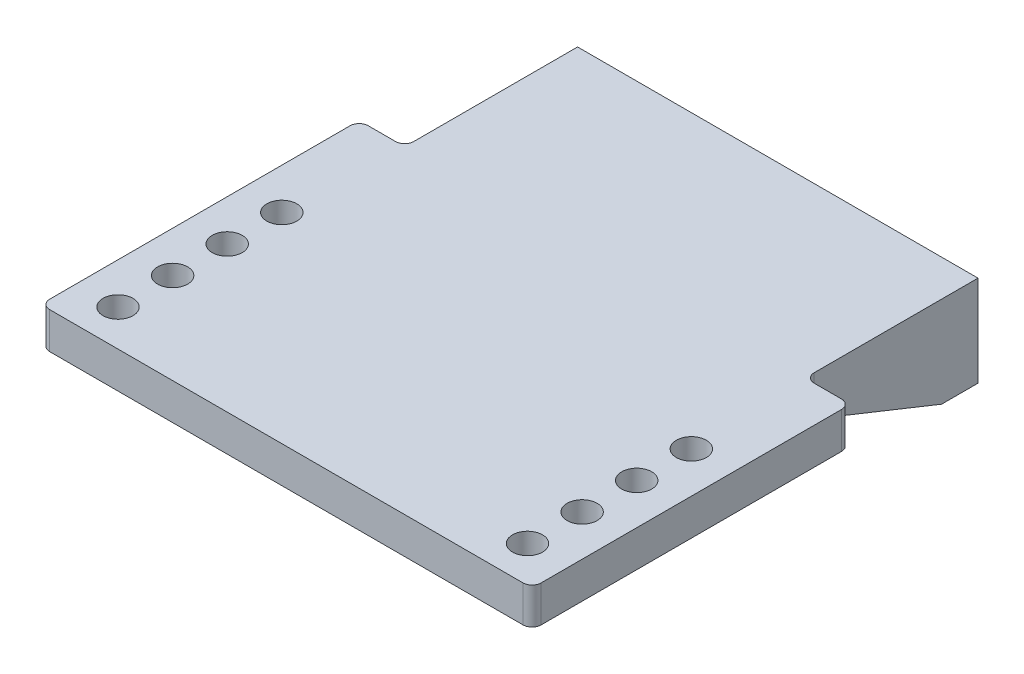
ISO-10303-21;
HEADER;
FILE_DESCRIPTION(('STEP AP214'),'2;1');
FILE_NAME('part.step','',(''),(''),'','','');
FILE_SCHEMA(('AUTOMOTIVE_DESIGN { 1 0 10303 214 1 1 1 1 }'));
ENDSEC;
DATA;
#1=APPLICATION_CONTEXT('core data for automotive mechanical design processes');
#2=APPLICATION_PROTOCOL_DEFINITION('international standard','automotive_design',2000,#1);
#3=PRODUCT_CONTEXT('',#1,'mechanical');
#4=PRODUCT('Part','Part','',(#3));
#5=PRODUCT_RELATED_PRODUCT_CATEGORY('part','',(#4));
#6=PRODUCT_DEFINITION_FORMATION('','',#4);
#7=PRODUCT_DEFINITION_CONTEXT('part definition',#1,'design');
#8=PRODUCT_DEFINITION('design','',#6,#7);
#9=PRODUCT_DEFINITION_SHAPE('','',#8);
#10=(LENGTH_UNIT() NAMED_UNIT(*) SI_UNIT(.MILLI.,.METRE.));
#11=(NAMED_UNIT(*) PLANE_ANGLE_UNIT() SI_UNIT($,.RADIAN.));
#12=(NAMED_UNIT(*) SI_UNIT($,.STERADIAN.) SOLID_ANGLE_UNIT());
#13=UNCERTAINTY_MEASURE_WITH_UNIT(LENGTH_MEASURE(1.E-05),#10,'distance_accuracy_value','');
#14=(GEOMETRIC_REPRESENTATION_CONTEXT(3) GLOBAL_UNCERTAINTY_ASSIGNED_CONTEXT((#13)) GLOBAL_UNIT_ASSIGNED_CONTEXT((#10,
#11,#12)) REPRESENTATION_CONTEXT('',''));
#15=CARTESIAN_POINT('',(0.,0.,0.));
#16=DIRECTION('',(0.,0.,1.));
#17=DIRECTION('',(1.,0.,0.));
#18=AXIS2_PLACEMENT_3D('',#15,#16,#17);
#19=CARTESIAN_POINT('',(44.5,31.9999999999999,18.));
#20=DIRECTION('',(0.,-1.,0.));
#21=DIRECTION('',(1.,0.,0.));
#22=AXIS2_PLACEMENT_3D('',#19,#20,#21);
#23=CYLINDRICAL_SURFACE('',#22,1.65);
#24=CARTESIAN_POINT('',(44.5,31.9999999999999,18.));
#25=DIRECTION('',(0.,-1.,0.));
#26=DIRECTION('',(1.,0.,0.));
#27=AXIS2_PLACEMENT_3D('',#24,#25,#26);
#28=CIRCLE('',#27,1.65);
#29=CARTESIAN_POINT('',(46.15,31.9999999999999,18.));
#30=VERTEX_POINT('',#29);
#31=EDGE_CURVE('E49',#30,#30,#28,.T.);
#32=ORIENTED_EDGE('',*,*,#31,.F.);
#33=EDGE_LOOP('',(#32));
#34=FACE_BOUND('',#33,.T.);
#35=CARTESIAN_POINT('',(44.5,27.9999999999999,18.));
#36=DIRECTION('',(0.,-1.,0.));
#37=DIRECTION('',(1.,0.,0.));
#38=AXIS2_PLACEMENT_3D('',#35,#36,#37);
#39=CIRCLE('',#38,1.65);
#40=CARTESIAN_POINT('',(46.15,27.9999999999999,18.));
#41=VERTEX_POINT('',#40);
#42=EDGE_CURVE('E11',#41,#41,#39,.T.);
#43=ORIENTED_EDGE('',*,*,#42,.T.);
#44=EDGE_LOOP('',(#43));
#45=FACE_BOUND('',#44,.T.);
#46=ADVANCED_FACE('F40',(#34,#45),#23,.F.);
#47=CARTESIAN_POINT('',(44.5,31.9999999999999,12.));
#48=DIRECTION('',(0.,-1.,0.));
#49=DIRECTION('',(1.,0.,0.));
#50=AXIS2_PLACEMENT_3D('',#47,#48,#49);
#51=CYLINDRICAL_SURFACE('',#50,1.65);
#52=CARTESIAN_POINT('',(44.5,31.9999999999999,12.));
#53=DIRECTION('',(0.,-1.,0.));
#54=DIRECTION('',(1.,0.,0.));
#55=AXIS2_PLACEMENT_3D('',#52,#53,#54);
#56=CIRCLE('',#55,1.65);
#57=CARTESIAN_POINT('',(46.15,31.9999999999999,12.));
#58=VERTEX_POINT('',#57);
#59=EDGE_CURVE('E320',#58,#58,#56,.T.);
#60=ORIENTED_EDGE('',*,*,#59,.F.);
#61=EDGE_LOOP('',(#60));
#62=FACE_BOUND('',#61,.T.);
#63=CARTESIAN_POINT('',(44.5,27.9999999999999,12.));
#64=DIRECTION('',(0.,-1.,0.));
#65=DIRECTION('',(1.,0.,0.));
#66=AXIS2_PLACEMENT_3D('',#63,#64,#65);
#67=CIRCLE('',#66,1.65);
#68=CARTESIAN_POINT('',(46.15,27.9999999999999,12.));
#69=VERTEX_POINT('',#68);
#70=EDGE_CURVE('E324',#69,#69,#67,.T.);
#71=ORIENTED_EDGE('',*,*,#70,.T.);
#72=EDGE_LOOP('',(#71));
#73=FACE_BOUND('',#72,.T.);
#74=ADVANCED_FACE('F335',(#62,#73),#51,.F.);
#75=CARTESIAN_POINT('',(-0.499999999999994,31.9999999999999,18.));
#76=DIRECTION('',(0.,-1.,0.));
#77=DIRECTION('',(1.,0.,0.));
#78=AXIS2_PLACEMENT_3D('',#75,#76,#77);
#79=CYLINDRICAL_SURFACE('',#78,1.65);
#80=CARTESIAN_POINT('',(-0.499999999999994,31.9999999999999,18.));
#81=DIRECTION('',(0.,-1.,0.));
#82=DIRECTION('',(1.,0.,0.));
#83=AXIS2_PLACEMENT_3D('',#80,#81,#82);
#84=CIRCLE('',#83,1.65);
#85=CARTESIAN_POINT('',(1.15000000000001,31.9999999999999,18.));
#86=VERTEX_POINT('',#85);
#87=EDGE_CURVE('E312',#86,#86,#84,.T.);
#88=ORIENTED_EDGE('',*,*,#87,.F.);
#89=EDGE_LOOP('',(#88));
#90=FACE_BOUND('',#89,.T.);
#91=CARTESIAN_POINT('',(-0.499999999999994,27.9999999999999,18.));
#92=DIRECTION('',(0.,-1.,0.));
#93=DIRECTION('',(1.,0.,0.));
#94=AXIS2_PLACEMENT_3D('',#91,#92,#93);
#95=CIRCLE('',#94,1.65);
#96=CARTESIAN_POINT('',(1.15000000000001,27.9999999999999,18.));
#97=VERTEX_POINT('',#96);
#98=EDGE_CURVE('E316',#97,#97,#95,.T.);
#99=ORIENTED_EDGE('',*,*,#98,.T.);
#100=EDGE_LOOP('',(#99));
#101=FACE_BOUND('',#100,.T.);
#102=ADVANCED_FACE('F412',(#90,#101),#79,.F.);
#103=CARTESIAN_POINT('',(-0.499999999999994,31.9999999999999,12.));
#104=DIRECTION('',(0.,-1.,0.));
#105=DIRECTION('',(1.,0.,0.));
#106=AXIS2_PLACEMENT_3D('',#103,#104,#105);
#107=CYLINDRICAL_SURFACE('',#106,1.65);
#108=CARTESIAN_POINT('',(-0.499999999999994,31.9999999999999,12.));
#109=DIRECTION('',(0.,-1.,0.));
#110=DIRECTION('',(1.,0.,0.));
#111=AXIS2_PLACEMENT_3D('',#108,#109,#110);
#112=CIRCLE('',#111,1.65);
#113=CARTESIAN_POINT('',(1.15000000000001,31.9999999999999,12.));
#114=VERTEX_POINT('',#113);
#115=EDGE_CURVE('E304',#114,#114,#112,.T.);
#116=ORIENTED_EDGE('',*,*,#115,.F.);
#117=EDGE_LOOP('',(#116));
#118=FACE_BOUND('',#117,.T.);
#119=CARTESIAN_POINT('',(-0.499999999999994,27.9999999999999,12.));
#120=DIRECTION('',(0.,-1.,0.));
#121=DIRECTION('',(1.,0.,0.));
#122=AXIS2_PLACEMENT_3D('',#119,#120,#121);
#123=CIRCLE('',#122,1.65);
#124=CARTESIAN_POINT('',(1.15000000000001,27.9999999999999,12.));
#125=VERTEX_POINT('',#124);
#126=EDGE_CURVE('E308',#125,#125,#123,.T.);
#127=ORIENTED_EDGE('',*,*,#126,.T.);
#128=EDGE_LOOP('',(#127));
#129=FACE_BOUND('',#128,.T.);
#130=ADVANCED_FACE('F382',(#118,#129),#107,.F.);
#131=CARTESIAN_POINT('',(0.,22.0000000000001,-28.));
#132=DIRECTION('',(1.,0.,0.));
#133=DIRECTION('',(0.,1.,0.));
#134=AXIS2_PLACEMENT_3D('',#131,#132,#133);
#135=PLANE('',#134);
#136=DIRECTION('',(0.,-0.371390676354101,-0.928476690885261));
#137=VECTOR('',#136,1.);
#138=CARTESIAN_POINT('',(0.,28.,-13.));
#139=LINE('',#138,#137);
#140=CARTESIAN_POINT('',(0.,27.6,-14.));
#141=VERTEX_POINT('',#140);
#142=CARTESIAN_POINT('',(0.,22.0000000000001,-28.));
#143=VERTEX_POINT('',#142);
#144=EDGE_CURVE('E793',#141,#143,#139,.T.);
#145=ORIENTED_EDGE('',*,*,#144,.F.);
#146=DIRECTION('',(0.,-1.,0.));
#147=VECTOR('',#146,1.);
#148=CARTESIAN_POINT('',(0.,32.,-14.));
#149=LINE('',#148,#147);
#150=CARTESIAN_POINT('',(0.,32.,-14.));
#151=VERTEX_POINT('',#150);
#152=EDGE_CURVE('E288',#141,#151,#149,.F.);
#153=ORIENTED_EDGE('',*,*,#152,.T.);
#154=DIRECTION('',(0.,0.,-1.));
#155=VECTOR('',#154,1.);
#156=CARTESIAN_POINT('',(0.,32.0000000000001,-28.));
#157=LINE('',#156,#155);
#158=CARTESIAN_POINT('',(0.,32.0000000000001,-32.));
#159=VERTEX_POINT('',#158);
#160=EDGE_CURVE('E857',#151,#159,#157,.T.);
#161=ORIENTED_EDGE('',*,*,#160,.T.);
#162=DIRECTION('',(0.,-1.,0.));
#163=VECTOR('',#162,1.);
#164=CARTESIAN_POINT('',(0.,22.0000000000001,-32.));
#165=LINE('',#164,#163);
#166=CARTESIAN_POINT('',(0.,22.0000000000001,-32.));
#167=VERTEX_POINT('',#166);
#168=EDGE_CURVE('E849',#159,#167,#165,.T.);
#169=ORIENTED_EDGE('',*,*,#168,.T.);
#170=DIRECTION('',(0.,0.,-1.));
#171=VECTOR('',#170,1.);
#172=CARTESIAN_POINT('',(0.,22.0000000000001,-28.));
#173=LINE('',#172,#171);
#174=EDGE_CURVE('E882',#143,#167,#173,.T.);
#175=ORIENTED_EDGE('',*,*,#174,.F.);
#176=EDGE_LOOP('',(#145,#153,#161,#169,#175));
#177=FACE_BOUND('',#176,.T.);
#178=ADVANCED_FACE('F375',(#177),#135,.F.);
#179=CARTESIAN_POINT('',(44.,22.0000000000001,-28.));
#180=DIRECTION('',(-1.,0.,0.));
#181=DIRECTION('',(0.,-1.,0.));
#182=AXIS2_PLACEMENT_3D('',#179,#180,#181);
#183=PLANE('',#182);
#184=DIRECTION('',(0.,0.,-1.));
#185=VECTOR('',#184,1.);
#186=CARTESIAN_POINT('',(44.,32.0000000000001,-28.));
#187=LINE('',#186,#185);
#188=CARTESIAN_POINT('',(44.,32.,-14.));
#189=VERTEX_POINT('',#188);
#190=CARTESIAN_POINT('',(44.,32.0000000000001,-32.));
#191=VERTEX_POINT('',#190);
#192=EDGE_CURVE('E875',#189,#191,#187,.T.);
#193=ORIENTED_EDGE('',*,*,#192,.F.);
#194=DIRECTION('',(0.,1.,0.));
#195=VECTOR('',#194,1.);
#196=CARTESIAN_POINT('',(44.,28.,-14.));
#197=LINE('',#196,#195);
#198=CARTESIAN_POINT('',(44.,27.6,-14.));
#199=VERTEX_POINT('',#198);
#200=EDGE_CURVE('E232',#189,#199,#197,.F.);
#201=ORIENTED_EDGE('',*,*,#200,.T.);
#202=DIRECTION('',(0.,-0.371390676354101,-0.928476690885261));
#203=VECTOR('',#202,1.);
#204=CARTESIAN_POINT('',(44.,28.,-13.));
#205=LINE('',#204,#203);
#206=CARTESIAN_POINT('',(44.,22.0000000000001,-28.));
#207=VERTEX_POINT('',#206);
#208=EDGE_CURVE('E815',#199,#207,#205,.T.);
#209=ORIENTED_EDGE('',*,*,#208,.T.);
#210=DIRECTION('',(0.,0.,-1.));
#211=VECTOR('',#210,1.);
#212=CARTESIAN_POINT('',(44.,22.0000000000001,-28.));
#213=LINE('',#212,#211);
#214=CARTESIAN_POINT('',(44.,22.0000000000001,-32.));
#215=VERTEX_POINT('',#214);
#216=EDGE_CURVE('E878',#207,#215,#213,.T.);
#217=ORIENTED_EDGE('',*,*,#216,.T.);
#218=DIRECTION('',(0.,1.,0.));
#219=VECTOR('',#218,1.);
#220=CARTESIAN_POINT('',(44.,22.0000000000001,-32.));
#221=LINE('',#220,#219);
#222=EDGE_CURVE('E865',#215,#191,#221,.T.);
#223=ORIENTED_EDGE('',*,*,#222,.T.);
#224=EDGE_LOOP('',(#193,#201,#209,#217,#223));
#225=FACE_BOUND('',#224,.T.);
#226=ADVANCED_FACE('F372',(#225),#183,.F.);
#227=CARTESIAN_POINT('',(0.,22.0000000000001,-28.));
#228=DIRECTION('',(0.,0.,-1.));
#229=DIRECTION('',(0.,1.,0.));
#230=AXIS2_PLACEMENT_3D('',#227,#228,#229);
#231=PLANE('',#230);
#232=CARTESIAN_POINT('',(6.,25.0000000000001,-28.));
#233=DIRECTION('',(0.,0.,1.));
#234=DIRECTION('',(0.,-1.,0.));
#235=AXIS2_PLACEMENT_3D('',#232,#233,#234);
#236=CIRCLE('',#235,1.65);
#237=CARTESIAN_POINT('',(6.,23.3500000000001,-28.));
#238=VERTEX_POINT('',#237);
#239=EDGE_CURVE('E837',#238,#238,#236,.T.);
#240=ORIENTED_EDGE('',*,*,#239,.F.);
#241=EDGE_LOOP('',(#240));
#242=FACE_BOUND('',#241,.T.);
#243=DIRECTION('',(1.,0.,0.));
#244=VECTOR('',#243,1.);
#245=CARTESIAN_POINT('',(0.,28.0000000000001,-28.));
#246=LINE('',#245,#244);
#247=CARTESIAN_POINT('',(3.,28.0000000000001,-28.));
#248=VERTEX_POINT('',#247);
#249=CARTESIAN_POINT('',(20.5,28.0000000000001,-28.));
#250=VERTEX_POINT('',#249);
#251=EDGE_CURVE('E177',#248,#250,#246,.T.);
#252=ORIENTED_EDGE('',*,*,#251,.F.);
#253=DIRECTION('',(0.,-1.,0.));
#254=VECTOR('',#253,1.);
#255=CARTESIAN_POINT('',(3.,22.0000000000001,-28.));
#256=LINE('',#255,#254);
#257=CARTESIAN_POINT('',(3.,22.0000000000001,-28.));
#258=VERTEX_POINT('',#257);
#259=EDGE_CURVE('E798',#248,#258,#256,.T.);
#260=ORIENTED_EDGE('',*,*,#259,.T.);
#261=DIRECTION('',(1.,0.,0.));
#262=VECTOR('',#261,1.);
#263=CARTESIAN_POINT('',(0.,22.0000000000001,-28.));
#264=LINE('',#263,#262);
#265=CARTESIAN_POINT('',(20.5,22.0000000000001,-28.));
#266=VERTEX_POINT('',#265);
#267=EDGE_CURVE('E196',#258,#266,#264,.T.);
#268=ORIENTED_EDGE('',*,*,#267,.T.);
#269=DIRECTION('',(0.,-1.,0.));
#270=VECTOR('',#269,1.);
#271=CARTESIAN_POINT('',(20.5,22.0000000000001,-28.));
#272=LINE('',#271,#270);
#273=EDGE_CURVE('E193',#250,#266,#272,.T.);
#274=ORIENTED_EDGE('',*,*,#273,.F.);
#275=EDGE_LOOP('',(#252,#260,#268,#274));
#276=FACE_BOUND('',#275,.T.);
#277=ADVANCED_FACE('F194',(#242,#276),#231,.F.);
#278=CARTESIAN_POINT('',(38.,25.0000000000001,-28.));
#279=DIRECTION('',(0.,0.,1.));
#280=DIRECTION('',(0.,-1.,0.));
#281=AXIS2_PLACEMENT_3D('',#278,#279,#280);
#282=CIRCLE('',#281,1.65);
#283=CARTESIAN_POINT('',(38.,23.3500000000001,-28.));
#284=VERTEX_POINT('',#283);
#285=EDGE_CURVE('E845',#284,#284,#282,.T.);
#286=ORIENTED_EDGE('',*,*,#285,.F.);
#287=EDGE_LOOP('',(#286));
#288=FACE_BOUND('',#287,.T.);
#289=CARTESIAN_POINT('',(23.5,28.0000000000001,-28.));
#290=VERTEX_POINT('',#289);
#291=CARTESIAN_POINT('',(41.,28.0000000000001,-28.));
#292=VERTEX_POINT('',#291);
#293=EDGE_CURVE('E190',#290,#292,#246,.T.);
#294=ORIENTED_EDGE('',*,*,#293,.F.);
#295=DIRECTION('',(0.,-1.,0.));
#296=VECTOR('',#295,1.);
#297=CARTESIAN_POINT('',(23.5,22.0000000000001,-28.));
#298=LINE('',#297,#296);
#299=CARTESIAN_POINT('',(23.5,22.0000000000001,-28.));
#300=VERTEX_POINT('',#299);
#301=EDGE_CURVE('E202',#290,#300,#298,.T.);
#302=ORIENTED_EDGE('',*,*,#301,.T.);
#303=CARTESIAN_POINT('',(41.,22.0000000000001,-28.));
#304=VERTEX_POINT('',#303);
#305=EDGE_CURVE('E858',#300,#304,#264,.T.);
#306=ORIENTED_EDGE('',*,*,#305,.T.);
#307=DIRECTION('',(0.,-1.,0.));
#308=VECTOR('',#307,1.);
#309=CARTESIAN_POINT('',(41.,22.0000000000001,-28.));
#310=LINE('',#309,#308);
#311=EDGE_CURVE('E818',#292,#304,#310,.T.);
#312=ORIENTED_EDGE('',*,*,#311,.F.);
#313=EDGE_LOOP('',(#294,#302,#306,#312));
#314=FACE_BOUND('',#313,.T.);
#315=ADVANCED_FACE('F360',(#288,#314),#231,.F.);
#316=CARTESIAN_POINT('',(0.,22.0000000000001,-32.));
#317=DIRECTION('',(0.,0.,-1.));
#318=DIRECTION('',(0.,1.,0.));
#319=AXIS2_PLACEMENT_3D('',#316,#317,#318);
#320=PLANE('',#319);
#321=ORIENTED_EDGE('',*,*,#222,.F.);
#322=DIRECTION('',(1.,0.,0.));
#323=VECTOR('',#322,1.);
#324=CARTESIAN_POINT('',(0.,22.0000000000001,-32.));
#325=LINE('',#324,#323);
#326=EDGE_CURVE('E862',#167,#215,#325,.T.);
#327=ORIENTED_EDGE('',*,*,#326,.F.);
#328=ORIENTED_EDGE('',*,*,#168,.F.);
#329=DIRECTION('',(-1.,0.,0.));
#330=VECTOR('',#329,1.);
#331=CARTESIAN_POINT('',(0.,32.0000000000001,-32.));
#332=LINE('',#331,#330);
#333=EDGE_CURVE('E869',#191,#159,#332,.T.);
#334=ORIENTED_EDGE('',*,*,#333,.F.);
#335=EDGE_LOOP('',(#321,#327,#328,#334));
#336=FACE_BOUND('',#335,.T.);
#337=CARTESIAN_POINT('',(38.,25.0000000000001,-32.));
#338=DIRECTION('',(0.,0.,1.));
#339=DIRECTION('',(0.,-1.,0.));
#340=AXIS2_PLACEMENT_3D('',#337,#338,#339);
#341=CIRCLE('',#340,1.65);
#342=CARTESIAN_POINT('',(38.,23.3500000000001,-32.));
#343=VERTEX_POINT('',#342);
#344=EDGE_CURVE('E841',#343,#343,#341,.T.);
#345=ORIENTED_EDGE('',*,*,#344,.T.);
#346=EDGE_LOOP('',(#345));
#347=FACE_BOUND('',#346,.T.);
#348=CARTESIAN_POINT('',(6.,25.0000000000001,-32.));
#349=DIRECTION('',(0.,0.,1.));
#350=DIRECTION('',(0.,-1.,0.));
#351=AXIS2_PLACEMENT_3D('',#348,#349,#350);
#352=CIRCLE('',#351,1.65);
#353=CARTESIAN_POINT('',(6.,23.3500000000001,-32.));
#354=VERTEX_POINT('',#353);
#355=EDGE_CURVE('E835',#354,#354,#352,.T.);
#356=ORIENTED_EDGE('',*,*,#355,.T.);
#357=EDGE_LOOP('',(#356));
#358=FACE_BOUND('',#357,.T.);
#359=ADVANCED_FACE('F363',(#336,#347,#358),#320,.T.);
#360=CARTESIAN_POINT('',(0.,22.0000000000001,-28.));
#361=DIRECTION('',(0.,1.,0.));
#362=DIRECTION('',(-1.,0.,0.));
#363=AXIS2_PLACEMENT_3D('',#360,#361,#362);
#364=PLANE('',#363);
#365=ORIENTED_EDGE('',*,*,#267,.F.);
#366=EDGE_CURVE('E853',#143,#258,#264,.T.);
#367=ORIENTED_EDGE('',*,*,#366,.F.);
#368=ORIENTED_EDGE('',*,*,#174,.T.);
#369=ORIENTED_EDGE('',*,*,#326,.T.);
#370=ORIENTED_EDGE('',*,*,#216,.F.);
#371=DIRECTION('',(1.,0.,0.));
#372=VECTOR('',#371,1.);
#373=CARTESIAN_POINT('',(0.,22.0000000000001,-28.));
#374=LINE('',#373,#372);
#375=EDGE_CURVE('E825',#304,#207,#374,.T.);
#376=ORIENTED_EDGE('',*,*,#375,.F.);
#377=ORIENTED_EDGE('',*,*,#305,.F.);
#378=DIRECTION('',(1.,0.,0.));
#379=VECTOR('',#378,1.);
#380=CARTESIAN_POINT('',(0.,22.0000000000001,-28.));
#381=LINE('',#380,#379);
#382=EDGE_CURVE('E810',#266,#300,#381,.T.);
#383=ORIENTED_EDGE('',*,*,#382,.F.);
#384=EDGE_LOOP('',(#365,#367,#368,#369,#370,#376,#377,#383));
#385=FACE_BOUND('',#384,.T.);
#386=ADVANCED_FACE('F367',(#385),#364,.F.);
#387=CARTESIAN_POINT('',(0.,32.0000000000001,-28.));
#388=DIRECTION('',(0.,-1.,0.));
#389=DIRECTION('',(1.,0.,0.));
#390=AXIS2_PLACEMENT_3D('',#387,#388,#389);
#391=PLANE('',#390);
#392=CARTESIAN_POINT('',(44.5,32.,6.00000000000002));
#393=DIRECTION('',(0.,-1.,0.));
#394=DIRECTION('',(1.,0.,0.));
#395=AXIS2_PLACEMENT_3D('',#392,#393,#394);
#396=CIRCLE('',#395,1.65);
#397=CARTESIAN_POINT('',(46.15,32.,6.00000000000002));
#398=VERTEX_POINT('',#397);
#399=EDGE_CURVE('E730',#398,#398,#396,.T.);
#400=ORIENTED_EDGE('',*,*,#399,.T.);
#401=EDGE_LOOP('',(#400));
#402=FACE_BOUND('',#401,.T.);
#403=CARTESIAN_POINT('',(-0.499999999999994,32.,6.00000000000001));
#404=DIRECTION('',(0.,-1.,0.));
#405=DIRECTION('',(1.,0.,0.));
#406=AXIS2_PLACEMENT_3D('',#403,#404,#405);
#407=CIRCLE('',#406,1.65);
#408=CARTESIAN_POINT('',(1.15000000000001,32.,6.00000000000001));
#409=VERTEX_POINT('',#408);
#410=EDGE_CURVE('E734',#409,#409,#407,.T.);
#411=ORIENTED_EDGE('',*,*,#410,.T.);
#412=EDGE_LOOP('',(#411));
#413=FACE_BOUND('',#412,.T.);
#414=CARTESIAN_POINT('',(-0.499999999999994,32.,0.));
#415=DIRECTION('',(0.,-1.,0.));
#416=DIRECTION('',(1.,0.,0.));
#417=AXIS2_PLACEMENT_3D('',#414,#415,#416);
#418=CIRCLE('',#417,1.65);
#419=CARTESIAN_POINT('',(1.15000000000001,32.,0.));
#420=VERTEX_POINT('',#419);
#421=EDGE_CURVE('E747',#420,#420,#418,.T.);
#422=ORIENTED_EDGE('',*,*,#421,.T.);
#423=EDGE_LOOP('',(#422));
#424=FACE_BOUND('',#423,.T.);
#425=CARTESIAN_POINT('',(44.5,32.,0.));
#426=DIRECTION('',(0.,-1.,0.));
#427=DIRECTION('',(1.,0.,0.));
#428=AXIS2_PLACEMENT_3D('',#425,#426,#427);
#429=CIRCLE('',#428,1.65);
#430=CARTESIAN_POINT('',(46.15,32.,0.));
#431=VERTEX_POINT('',#430);
#432=EDGE_CURVE('E756',#431,#431,#429,.T.);
#433=ORIENTED_EDGE('',*,*,#432,.T.);
#434=EDGE_LOOP('',(#433));
#435=FACE_BOUND('',#434,.T.);
#436=DIRECTION('',(0.,0.,1.));
#437=VECTOR('',#436,1.);
#438=CARTESIAN_POINT('',(49.,32.,-13.));
#439=LINE('',#438,#437);
#440=CARTESIAN_POINT('',(49.,32.,-12.));
#441=VERTEX_POINT('',#440);
#442=CARTESIAN_POINT('',(49.,31.9999999999999,21.));
#443=VERTEX_POINT('',#442);
#444=EDGE_CURVE('E782',#441,#443,#439,.T.);
#445=ORIENTED_EDGE('',*,*,#444,.F.);
#446=CARTESIAN_POINT('',(48.,32.,-12.));
#447=DIRECTION('',(0.,-1.,0.));
#448=DIRECTION('',(1.,0.,0.));
#449=AXIS2_PLACEMENT_3D('',#446,#447,#448);
#450=CIRCLE('',#449,1.);
#451=CARTESIAN_POINT('',(48.,32.,-13.));
#452=VERTEX_POINT('',#451);
#453=EDGE_CURVE('E252',#441,#452,#450,.F.);
#454=ORIENTED_EDGE('',*,*,#453,.T.);
#455=DIRECTION('',(-1.,0.,0.));
#456=VECTOR('',#455,1.);
#457=CARTESIAN_POINT('',(49.,32.,-13.));
#458=LINE('',#457,#456);
#459=CARTESIAN_POINT('',(45.,32.,-13.));
#460=VERTEX_POINT('',#459);
#461=EDGE_CURVE('E786',#452,#460,#458,.T.);
#462=ORIENTED_EDGE('',*,*,#461,.T.);
#463=CARTESIAN_POINT('',(45.,32.,-14.));
#464=DIRECTION('',(0.,-1.,0.));
#465=DIRECTION('',(1.,0.,0.));
#466=AXIS2_PLACEMENT_3D('',#463,#464,#465);
#467=CIRCLE('',#466,1.);
#468=EDGE_CURVE('E291',#460,#189,#467,.T.);
#469=ORIENTED_EDGE('',*,*,#468,.T.);
#470=ORIENTED_EDGE('',*,*,#192,.T.);
#471=ORIENTED_EDGE('',*,*,#333,.T.);
#472=ORIENTED_EDGE('',*,*,#160,.F.);
#473=CARTESIAN_POINT('',(-1.,32.,-14.));
#474=DIRECTION('',(0.,-1.,0.));
#475=DIRECTION('',(1.,0.,0.));
#476=AXIS2_PLACEMENT_3D('',#473,#474,#475);
#477=CIRCLE('',#476,1.);
#478=CARTESIAN_POINT('',(-1.,32.,-13.));
#479=VERTEX_POINT('',#478);
#480=EDGE_CURVE('E301',#151,#479,#477,.T.);
#481=ORIENTED_EDGE('',*,*,#480,.T.);
#482=DIRECTION('',(1.,0.,0.));
#483=VECTOR('',#482,1.);
#484=CARTESIAN_POINT('',(-5.,32.,-13.));
#485=LINE('',#484,#483);
#486=CARTESIAN_POINT('',(-4.,32.,-13.));
#487=VERTEX_POINT('',#486);
#488=EDGE_CURVE('E774',#487,#479,#485,.T.);
#489=ORIENTED_EDGE('',*,*,#488,.F.);
#490=CARTESIAN_POINT('',(-4.,32.,-12.));
#491=DIRECTION('',(0.,-1.,0.));
#492=DIRECTION('',(1.,0.,0.));
#493=AXIS2_PLACEMENT_3D('',#490,#491,#492);
#494=CIRCLE('',#493,1.);
#495=CARTESIAN_POINT('',(-5.,32.,-12.));
#496=VERTEX_POINT('',#495);
#497=EDGE_CURVE('E243',#487,#496,#494,.F.);
#498=ORIENTED_EDGE('',*,*,#497,.T.);
#499=DIRECTION('',(0.,0.,-1.));
#500=VECTOR('',#499,1.);
#501=CARTESIAN_POINT('',(-5.,32.,-13.));
#502=LINE('',#501,#500);
#503=CARTESIAN_POINT('',(-5.,31.9999999999999,21.));
#504=VERTEX_POINT('',#503);
#505=EDGE_CURVE('E766',#504,#496,#502,.T.);
#506=ORIENTED_EDGE('',*,*,#505,.F.);
#507=CARTESIAN_POINT('',(-4.,31.9999999999999,21.));
#508=DIRECTION('',(0.,-1.,0.));
#509=DIRECTION('',(1.,0.,0.));
#510=AXIS2_PLACEMENT_3D('',#507,#508,#509);
#511=CIRCLE('',#510,1.);
#512=CARTESIAN_POINT('',(-4.,31.9999999999999,22.));
#513=VERTEX_POINT('',#512);
#514=EDGE_CURVE('E246',#504,#513,#511,.F.);
#515=ORIENTED_EDGE('',*,*,#514,.T.);
#516=DIRECTION('',(-1.,0.,0.));
#517=VECTOR('',#516,1.);
#518=CARTESIAN_POINT('',(0.,31.9999999999999,22.));
#519=LINE('',#518,#517);
#520=CARTESIAN_POINT('',(48.,31.9999999999999,22.));
#521=VERTEX_POINT('',#520);
#522=EDGE_CURVE('E832',#521,#513,#519,.T.);
#523=ORIENTED_EDGE('',*,*,#522,.F.);
#524=CARTESIAN_POINT('',(48.,31.9999999999999,21.));
#525=DIRECTION('',(0.,-1.,0.));
#526=DIRECTION('',(1.,0.,0.));
#527=AXIS2_PLACEMENT_3D('',#524,#525,#526);
#528=CIRCLE('',#527,1.);
#529=EDGE_CURVE('E249',#521,#443,#528,.F.);
#530=ORIENTED_EDGE('',*,*,#529,.T.);
#531=EDGE_LOOP('',(#445,#454,#462,#469,#470,#471,#472,#481,#489,#498,#506,#515,#523,#530));
#532=FACE_BOUND('',#531,.T.);
#533=ORIENTED_EDGE('',*,*,#115,.T.);
#534=EDGE_LOOP('',(#533));
#535=FACE_BOUND('',#534,.T.);
#536=ORIENTED_EDGE('',*,*,#87,.T.);
#537=EDGE_LOOP('',(#536));
#538=FACE_BOUND('',#537,.T.);
#539=ORIENTED_EDGE('',*,*,#59,.T.);
#540=EDGE_LOOP('',(#539));
#541=FACE_BOUND('',#540,.T.);
#542=ORIENTED_EDGE('',*,*,#31,.T.);
#543=EDGE_LOOP('',(#542));
#544=FACE_BOUND('',#543,.T.);
#545=ADVANCED_FACE('F331',(#402,#413,#424,#435,#532,#535,#538,#541,#544),#391,.F.);
#546=CARTESIAN_POINT('',(38.,25.0000000000001,-28.));
#547=DIRECTION('',(0.,0.,-1.));
#548=DIRECTION('',(0.,1.,0.));
#549=AXIS2_PLACEMENT_3D('',#546,#547,#548);
#550=CYLINDRICAL_SURFACE('',#549,1.65);
#551=ORIENTED_EDGE('',*,*,#285,.T.);
#552=EDGE_LOOP('',(#551));
#553=FACE_BOUND('',#552,.T.);
#554=ORIENTED_EDGE('',*,*,#344,.F.);
#555=EDGE_LOOP('',(#554));
#556=FACE_BOUND('',#555,.T.);
#557=ADVANCED_FACE('F350',(#553,#556),#550,.F.);
#558=CARTESIAN_POINT('',(6.,25.0000000000001,-28.));
#559=DIRECTION('',(0.,0.,-1.));
#560=DIRECTION('',(0.,1.,0.));
#561=AXIS2_PLACEMENT_3D('',#558,#559,#560);
#562=CYLINDRICAL_SURFACE('',#561,1.65);
#563=ORIENTED_EDGE('',*,*,#239,.T.);
#564=EDGE_LOOP('',(#563));
#565=FACE_BOUND('',#564,.T.);
#566=ORIENTED_EDGE('',*,*,#355,.F.);
#567=EDGE_LOOP('',(#566));
#568=FACE_BOUND('',#567,.T.);
#569=ADVANCED_FACE('F340',(#565,#568),#562,.F.);
#570=CARTESIAN_POINT('',(0.,27.9999999999999,22.));
#571=DIRECTION('',(0.,1.,0.));
#572=DIRECTION('',(-1.,0.,0.));
#573=AXIS2_PLACEMENT_3D('',#570,#571,#572);
#574=PLANE('',#573);
#575=CARTESIAN_POINT('',(44.5,28.,6.00000000000001));
#576=DIRECTION('',(0.,-1.,0.));
#577=DIRECTION('',(1.,0.,0.));
#578=AXIS2_PLACEMENT_3D('',#575,#576,#577);
#579=CIRCLE('',#578,1.65);
#580=CARTESIAN_POINT('',(46.15,28.,6.00000000000001));
#581=VERTEX_POINT('',#580);
#582=EDGE_CURVE('E732',#581,#581,#579,.T.);
#583=ORIENTED_EDGE('',*,*,#582,.F.);
#584=EDGE_LOOP('',(#583));
#585=FACE_BOUND('',#584,.T.);
#586=CARTESIAN_POINT('',(-0.499999999999994,28.,6.));
#587=DIRECTION('',(0.,-1.,0.));
#588=DIRECTION('',(1.,0.,0.));
#589=AXIS2_PLACEMENT_3D('',#586,#587,#588);
#590=CIRCLE('',#589,1.65);
#591=CARTESIAN_POINT('',(1.15000000000001,28.,6.));
#592=VERTEX_POINT('',#591);
#593=EDGE_CURVE('E739',#592,#592,#590,.T.);
#594=ORIENTED_EDGE('',*,*,#593,.F.);
#595=EDGE_LOOP('',(#594));
#596=FACE_BOUND('',#595,.T.);
#597=CARTESIAN_POINT('',(-0.499999999999994,28.,0.));
#598=DIRECTION('',(0.,-1.,0.));
#599=DIRECTION('',(1.,0.,0.));
#600=AXIS2_PLACEMENT_3D('',#597,#598,#599);
#601=CIRCLE('',#600,1.65);
#602=CARTESIAN_POINT('',(1.15000000000001,28.,0.));
#603=VERTEX_POINT('',#602);
#604=EDGE_CURVE('E752',#603,#603,#601,.T.);
#605=ORIENTED_EDGE('',*,*,#604,.F.);
#606=EDGE_LOOP('',(#605));
#607=FACE_BOUND('',#606,.T.);
#608=CARTESIAN_POINT('',(44.5,28.,0.));
#609=DIRECTION('',(0.,-1.,0.));
#610=DIRECTION('',(1.,0.,0.));
#611=AXIS2_PLACEMENT_3D('',#608,#609,#610);
#612=CIRCLE('',#611,1.65);
#613=CARTESIAN_POINT('',(46.15,28.,0.));
#614=VERTEX_POINT('',#613);
#615=EDGE_CURVE('E746',#614,#614,#612,.T.);
#616=ORIENTED_EDGE('',*,*,#615,.F.);
#617=EDGE_LOOP('',(#616));
#618=FACE_BOUND('',#617,.T.);
#619=DIRECTION('',(-1.,0.,0.));
#620=VECTOR('',#619,1.);
#621=CARTESIAN_POINT('',(49.,28.,-13.));
#622=LINE('',#621,#620);
#623=CARTESIAN_POINT('',(48.,28.,-13.));
#624=VERTEX_POINT('',#623);
#625=CARTESIAN_POINT('',(45.,28.,-13.));
#626=VERTEX_POINT('',#625);
#627=EDGE_CURVE('E790',#624,#626,#622,.T.);
#628=ORIENTED_EDGE('',*,*,#627,.F.);
#629=CARTESIAN_POINT('',(48.,28.,-12.));
#630=DIRECTION('',(0.,1.,0.));
#631=DIRECTION('',(-1.,0.,0.));
#632=AXIS2_PLACEMENT_3D('',#629,#630,#631);
#633=CIRCLE('',#632,1.);
#634=CARTESIAN_POINT('',(49.,28.,-12.));
#635=VERTEX_POINT('',#634);
#636=EDGE_CURVE('E264',#624,#635,#633,.F.);
#637=ORIENTED_EDGE('',*,*,#636,.T.);
#638=DIRECTION('',(0.,0.,-1.));
#639=VECTOR('',#638,1.);
#640=CARTESIAN_POINT('',(49.,28.,-13.));
#641=LINE('',#640,#639);
#642=CARTESIAN_POINT('',(49.,27.9999999999999,21.));
#643=VERTEX_POINT('',#642);
#644=EDGE_CURVE('E778',#643,#635,#641,.T.);
#645=ORIENTED_EDGE('',*,*,#644,.F.);
#646=CARTESIAN_POINT('',(48.,27.9999999999999,21.));
#647=DIRECTION('',(0.,1.,0.));
#648=DIRECTION('',(-1.,0.,0.));
#649=AXIS2_PLACEMENT_3D('',#646,#647,#648);
#650=CIRCLE('',#649,1.);
#651=CARTESIAN_POINT('',(48.,27.9999999999999,22.));
#652=VERTEX_POINT('',#651);
#653=EDGE_CURVE('E261',#643,#652,#650,.F.);
#654=ORIENTED_EDGE('',*,*,#653,.T.);
#655=DIRECTION('',(1.,0.,0.));
#656=VECTOR('',#655,1.);
#657=CARTESIAN_POINT('',(0.,27.9999999999999,22.));
#658=LINE('',#657,#656);
#659=CARTESIAN_POINT('',(-4.,27.9999999999999,22.));
#660=VERTEX_POINT('',#659);
#661=EDGE_CURVE('E189',#660,#652,#658,.T.);
#662=ORIENTED_EDGE('',*,*,#661,.F.);
#663=CARTESIAN_POINT('',(-4.,27.9999999999999,21.));
#664=DIRECTION('',(0.,1.,0.));
#665=DIRECTION('',(-1.,0.,0.));
#666=AXIS2_PLACEMENT_3D('',#663,#664,#665);
#667=CIRCLE('',#666,1.);
#668=CARTESIAN_POINT('',(-5.,27.9999999999999,21.));
#669=VERTEX_POINT('',#668);
#670=EDGE_CURVE('E258',#660,#669,#667,.F.);
#671=ORIENTED_EDGE('',*,*,#670,.T.);
#672=DIRECTION('',(0.,0.,1.));
#673=VECTOR('',#672,1.);
#674=CARTESIAN_POINT('',(-5.,28.,-13.));
#675=LINE('',#674,#673);
#676=CARTESIAN_POINT('',(-5.,28.,-12.));
#677=VERTEX_POINT('',#676);
#678=EDGE_CURVE('E751',#677,#669,#675,.T.);
#679=ORIENTED_EDGE('',*,*,#678,.F.);
#680=CARTESIAN_POINT('',(-4.,28.,-12.));
#681=DIRECTION('',(0.,1.,0.));
#682=DIRECTION('',(-1.,0.,0.));
#683=AXIS2_PLACEMENT_3D('',#680,#681,#682);
#684=CIRCLE('',#683,1.);
#685=CARTESIAN_POINT('',(-4.,28.,-13.));
#686=VERTEX_POINT('',#685);
#687=EDGE_CURVE('E255',#677,#686,#684,.F.);
#688=ORIENTED_EDGE('',*,*,#687,.T.);
#689=DIRECTION('',(1.,0.,0.));
#690=VECTOR('',#689,1.);
#691=CARTESIAN_POINT('',(-5.,28.,-13.));
#692=LINE('',#691,#690);
#693=CARTESIAN_POINT('',(-0.999999999999999,28.,-13.));
#694=VERTEX_POINT('',#693);
#695=EDGE_CURVE('E770',#686,#694,#692,.T.);
#696=ORIENTED_EDGE('',*,*,#695,.T.);
#697=DIRECTION('',(1.,0.,0.));
#698=VECTOR('',#697,1.);
#699=CARTESIAN_POINT('',(0.,28.,-13.));
#700=LINE('',#699,#698);
#701=CARTESIAN_POINT('',(3.,28.,-13.));
#702=VERTEX_POINT('',#701);
#703=EDGE_CURVE('E222',#694,#702,#700,.T.);
#704=ORIENTED_EDGE('',*,*,#703,.T.);
#705=DIRECTION('',(0.,0.,-1.));
#706=VECTOR('',#705,1.);
#707=CARTESIAN_POINT('',(3.,27.9999999999999,22.));
#708=LINE('',#707,#706);
#709=EDGE_CURVE('E185',#702,#248,#708,.T.);
#710=ORIENTED_EDGE('',*,*,#709,.T.);
#711=ORIENTED_EDGE('',*,*,#251,.T.);
#712=DIRECTION('',(0.,0.,-1.));
#713=VECTOR('',#712,1.);
#714=CARTESIAN_POINT('',(20.5,27.9999999999999,22.));
#715=LINE('',#714,#713);
#716=CARTESIAN_POINT('',(20.5,28.,-13.));
#717=VERTEX_POINT('',#716);
#718=EDGE_CURVE('E182',#717,#250,#715,.T.);
#719=ORIENTED_EDGE('',*,*,#718,.F.);
#720=DIRECTION('',(1.,0.,0.));
#721=VECTOR('',#720,1.);
#722=CARTESIAN_POINT('',(0.,28.,-13.));
#723=LINE('',#722,#721);
#724=CARTESIAN_POINT('',(23.5,28.,-13.));
#725=VERTEX_POINT('',#724);
#726=EDGE_CURVE('E208',#717,#725,#723,.T.);
#727=ORIENTED_EDGE('',*,*,#726,.T.);
#728=DIRECTION('',(0.,0.,-1.));
#729=VECTOR('',#728,1.);
#730=CARTESIAN_POINT('',(23.5,27.9999999999999,22.));
#731=LINE('',#730,#729);
#732=EDGE_CURVE('E212',#725,#290,#731,.T.);
#733=ORIENTED_EDGE('',*,*,#732,.T.);
#734=ORIENTED_EDGE('',*,*,#293,.T.);
#735=DIRECTION('',(0.,0.,-1.));
#736=VECTOR('',#735,1.);
#737=CARTESIAN_POINT('',(41.,27.9999999999999,22.));
#738=LINE('',#737,#736);
#739=CARTESIAN_POINT('',(41.,28.,-13.));
#740=VERTEX_POINT('',#739);
#741=EDGE_CURVE('E214',#740,#292,#738,.T.);
#742=ORIENTED_EDGE('',*,*,#741,.F.);
#743=DIRECTION('',(1.,0.,0.));
#744=VECTOR('',#743,1.);
#745=CARTESIAN_POINT('',(0.,28.,-13.));
#746=LINE('',#745,#744);
#747=EDGE_CURVE('E56',#740,#626,#746,.T.);
#748=ORIENTED_EDGE('',*,*,#747,.T.);
#749=EDGE_LOOP('',(#628,#637,#645,#654,#662,#671,#679,#688,#696,#704,#710,#711,#719,#727,#733,
#734,#742,#748));
#750=FACE_BOUND('',#749,.T.);
#751=ORIENTED_EDGE('',*,*,#126,.F.);
#752=EDGE_LOOP('',(#751));
#753=FACE_BOUND('',#752,.T.);
#754=ORIENTED_EDGE('',*,*,#98,.F.);
#755=EDGE_LOOP('',(#754));
#756=FACE_BOUND('',#755,.T.);
#757=ORIENTED_EDGE('',*,*,#70,.F.);
#758=EDGE_LOOP('',(#757));
#759=FACE_BOUND('',#758,.T.);
#760=ORIENTED_EDGE('',*,*,#42,.F.);
#761=EDGE_LOOP('',(#760));
#762=FACE_BOUND('',#761,.T.);
#763=ADVANCED_FACE('F179',(#585,#596,#607,#618,#750,#753,#756,#759,#762),#574,.F.);
#764=CARTESIAN_POINT('',(0.,21.9999999999999,22.));
#765=DIRECTION('',(0.,0.,1.));
#766=DIRECTION('',(0.,-1.,0.));
#767=AXIS2_PLACEMENT_3D('',#764,#765,#766);
#768=PLANE('',#767);
#769=ORIENTED_EDGE('',*,*,#661,.T.);
#770=DIRECTION('',(0.,-1.,0.));
#771=VECTOR('',#770,1.);
#772=CARTESIAN_POINT('',(48.,31.9999999999999,22.));
#773=LINE('',#772,#771);
#774=EDGE_CURVE('E270',#652,#521,#773,.F.);
#775=ORIENTED_EDGE('',*,*,#774,.T.);
#776=ORIENTED_EDGE('',*,*,#522,.T.);
#777=DIRECTION('',(0.,1.,0.));
#778=VECTOR('',#777,1.);
#779=CARTESIAN_POINT('',(-4.,21.9999999999999,22.));
#780=LINE('',#779,#778);
#781=EDGE_CURVE('E267',#513,#660,#780,.F.);
#782=ORIENTED_EDGE('',*,*,#781,.T.);
#783=EDGE_LOOP('',(#769,#775,#776,#782));
#784=FACE_BOUND('',#783,.T.);
#785=ADVANCED_FACE('F339',(#784),#768,.T.);
#786=CARTESIAN_POINT('',(44.,28.,-13.));
#787=DIRECTION('',(0.,-0.928476690885261,0.371390676354101));
#788=DIRECTION('',(0.,-0.371390676354101,-0.928476690885261));
#789=AXIS2_PLACEMENT_3D('',#786,#787,#788);
#790=PLANE('',#789);
#791=DIRECTION('',(0.,-0.371390676354101,-0.928476690885261));
#792=VECTOR('',#791,1.);
#793=CARTESIAN_POINT('',(41.,28.,-13.));
#794=LINE('',#793,#792);
#795=EDGE_CURVE('E814',#740,#304,#794,.T.);
#796=ORIENTED_EDGE('',*,*,#795,.T.);
#797=ORIENTED_EDGE('',*,*,#375,.T.);
#798=ORIENTED_EDGE('',*,*,#208,.F.);
#799=CARTESIAN_POINT('',(45.,27.6,-14.));
#800=DIRECTION('',(0.,-0.928476690885261,0.371390676354101));
#801=DIRECTION('',(0.,-0.371390676354101,-0.928476690885261));
#802=AXIS2_PLACEMENT_3D('',#799,#800,#801);
#803=ELLIPSE('',#802,1.0770329614269,1.);
#804=EDGE_CURVE('E294',#199,#626,#803,.F.);
#805=ORIENTED_EDGE('',*,*,#804,.T.);
#806=ORIENTED_EDGE('',*,*,#747,.F.);
#807=EDGE_LOOP('',(#796,#797,#798,#805,#806));
#808=FACE_BOUND('',#807,.T.);
#809=ADVANCED_FACE('F347',(#808),#790,.T.);
#810=CARTESIAN_POINT('',(41.,27.,-5.));
#811=DIRECTION('',(1.,0.,0.));
#812=DIRECTION('',(0.,1.,0.));
#813=AXIS2_PLACEMENT_3D('',#810,#811,#812);
#814=PLANE('',#813);
#815=ORIENTED_EDGE('',*,*,#741,.T.);
#816=ORIENTED_EDGE('',*,*,#311,.T.);
#817=ORIENTED_EDGE('',*,*,#795,.F.);
#818=EDGE_LOOP('',(#815,#816,#817));
#819=FACE_BOUND('',#818,.T.);
#820=ADVANCED_FACE('F507',(#819),#814,.F.);
#821=CARTESIAN_POINT('',(23.5,28.,-13.));
#822=DIRECTION('',(0.,-0.928476690885261,0.371390676354101));
#823=DIRECTION('',(0.,-0.371390676354101,-0.928476690885261));
#824=AXIS2_PLACEMENT_3D('',#821,#822,#823);
#825=PLANE('',#824);
#826=DIRECTION('',(0.,-0.371390676354101,-0.928476690885261));
#827=VECTOR('',#826,1.);
#828=CARTESIAN_POINT('',(20.5,28.,-13.));
#829=LINE('',#828,#827);
#830=EDGE_CURVE('E206',#717,#266,#829,.T.);
#831=ORIENTED_EDGE('',*,*,#830,.T.);
#832=ORIENTED_EDGE('',*,*,#382,.T.);
#833=DIRECTION('',(0.,-0.371390676354101,-0.928476690885261));
#834=VECTOR('',#833,1.);
#835=CARTESIAN_POINT('',(23.5,28.,-13.));
#836=LINE('',#835,#834);
#837=EDGE_CURVE('E203',#725,#300,#836,.T.);
#838=ORIENTED_EDGE('',*,*,#837,.F.);
#839=ORIENTED_EDGE('',*,*,#726,.F.);
#840=EDGE_LOOP('',(#831,#832,#838,#839));
#841=FACE_BOUND('',#840,.T.);
#842=ADVANCED_FACE('F515',(#841),#825,.T.);
#843=CARTESIAN_POINT('',(23.5,27.,-5.));
#844=DIRECTION('',(1.,0.,0.));
#845=DIRECTION('',(0.,1.,0.));
#846=AXIS2_PLACEMENT_3D('',#843,#844,#845);
#847=PLANE('',#846);
#848=ORIENTED_EDGE('',*,*,#301,.F.);
#849=ORIENTED_EDGE('',*,*,#732,.F.);
#850=ORIENTED_EDGE('',*,*,#837,.T.);
#851=EDGE_LOOP('',(#848,#849,#850));
#852=FACE_BOUND('',#851,.T.);
#853=ADVANCED_FACE('F524',(#852),#847,.T.);
#854=CARTESIAN_POINT('',(20.5,27.,-5.));
#855=DIRECTION('',(1.,0.,0.));
#856=DIRECTION('',(0.,1.,0.));
#857=AXIS2_PLACEMENT_3D('',#854,#855,#856);
#858=PLANE('',#857);
#859=ORIENTED_EDGE('',*,*,#718,.T.);
#860=ORIENTED_EDGE('',*,*,#273,.T.);
#861=ORIENTED_EDGE('',*,*,#830,.F.);
#862=EDGE_LOOP('',(#859,#860,#861));
#863=FACE_BOUND('',#862,.T.);
#864=ADVANCED_FACE('F205',(#863),#858,.F.);
#865=CARTESIAN_POINT('',(3.,28.,-13.));
#866=DIRECTION('',(0.,-0.928476690885261,0.371390676354101));
#867=DIRECTION('',(0.,-0.371390676354101,-0.928476690885261));
#868=AXIS2_PLACEMENT_3D('',#865,#866,#867);
#869=PLANE('',#868);
#870=ORIENTED_EDGE('',*,*,#703,.F.);
#871=CARTESIAN_POINT('',(-1.,27.6,-14.));
#872=DIRECTION('',(0.,-0.928476690885261,0.371390676354101));
#873=DIRECTION('',(0.,0.371390676354101,0.928476690885261));
#874=AXIS2_PLACEMENT_3D('',#871,#872,#873);
#875=ELLIPSE('',#874,1.0770329614269,1.);
#876=EDGE_CURVE('E298',#694,#141,#875,.F.);
#877=ORIENTED_EDGE('',*,*,#876,.T.);
#878=ORIENTED_EDGE('',*,*,#144,.T.);
#879=ORIENTED_EDGE('',*,*,#366,.T.);
#880=DIRECTION('',(0.,-0.371390676354101,-0.928476690885261));
#881=VECTOR('',#880,1.);
#882=CARTESIAN_POINT('',(3.,28.,-13.));
#883=LINE('',#882,#881);
#884=EDGE_CURVE('E794',#702,#258,#883,.T.);
#885=ORIENTED_EDGE('',*,*,#884,.F.);
#886=EDGE_LOOP('',(#870,#877,#878,#879,#885));
#887=FACE_BOUND('',#886,.T.);
#888=ADVANCED_FACE('F541',(#887),#869,.T.);
#889=CARTESIAN_POINT('',(3.,27.,-5.));
#890=DIRECTION('',(1.,0.,0.));
#891=DIRECTION('',(0.,1.,0.));
#892=AXIS2_PLACEMENT_3D('',#889,#890,#891);
#893=PLANE('',#892);
#894=ORIENTED_EDGE('',*,*,#709,.F.);
#895=ORIENTED_EDGE('',*,*,#884,.T.);
#896=ORIENTED_EDGE('',*,*,#259,.F.);
#897=EDGE_LOOP('',(#894,#895,#896));
#898=FACE_BOUND('',#897,.T.);
#899=ADVANCED_FACE('F549',(#898),#893,.T.);
#900=CARTESIAN_POINT('',(49.,28.,-13.));
#901=DIRECTION('',(0.,0.,1.));
#902=DIRECTION('',(0.,-1.,0.));
#903=AXIS2_PLACEMENT_3D('',#900,#901,#902);
#904=PLANE('',#903);
#905=ORIENTED_EDGE('',*,*,#627,.T.);
#906=DIRECTION('',(0.,1.,0.));
#907=VECTOR('',#906,1.);
#908=CARTESIAN_POINT('',(45.,32.,-13.));
#909=LINE('',#908,#907);
#910=EDGE_CURVE('E228',#626,#460,#909,.T.);
#911=ORIENTED_EDGE('',*,*,#910,.T.);
#912=ORIENTED_EDGE('',*,*,#461,.F.);
#913=DIRECTION('',(0.,1.,0.));
#914=VECTOR('',#913,1.);
#915=CARTESIAN_POINT('',(48.,28.,-13.));
#916=LINE('',#915,#914);
#917=EDGE_CURVE('E225',#452,#624,#916,.F.);
#918=ORIENTED_EDGE('',*,*,#917,.T.);
#919=EDGE_LOOP('',(#905,#911,#912,#918));
#920=FACE_BOUND('',#919,.T.);
#921=ADVANCED_FACE('F558',(#920),#904,.F.);
#922=CARTESIAN_POINT('',(49.,22.0000000000001,-32.));
#923=DIRECTION('',(-1.,0.,0.));
#924=DIRECTION('',(0.,-1.,0.));
#925=AXIS2_PLACEMENT_3D('',#922,#923,#924);
#926=PLANE('',#925);
#927=ORIENTED_EDGE('',*,*,#644,.T.);
#928=DIRECTION('',(0.,1.,0.));
#929=VECTOR('',#928,1.);
#930=CARTESIAN_POINT('',(49.,22.,-12.));
#931=LINE('',#930,#929);
#932=EDGE_CURVE('E239',#635,#441,#931,.T.);
#933=ORIENTED_EDGE('',*,*,#932,.T.);
#934=ORIENTED_EDGE('',*,*,#444,.T.);
#935=DIRECTION('',(0.,-1.,0.));
#936=VECTOR('',#935,1.);
#937=CARTESIAN_POINT('',(49.,27.9999999999999,21.));
#938=LINE('',#937,#936);
#939=EDGE_CURVE('E235',#443,#643,#938,.T.);
#940=ORIENTED_EDGE('',*,*,#939,.T.);
#941=EDGE_LOOP('',(#927,#933,#934,#940));
#942=FACE_BOUND('',#941,.T.);
#943=ADVANCED_FACE('F567',(#942),#926,.F.);
#944=CARTESIAN_POINT('',(-5.,28.,-13.));
#945=DIRECTION('',(0.,0.,1.));
#946=DIRECTION('',(0.,-1.,0.));
#947=AXIS2_PLACEMENT_3D('',#944,#945,#946);
#948=PLANE('',#947);
#949=ORIENTED_EDGE('',*,*,#695,.F.);
#950=DIRECTION('',(0.,-1.,0.));
#951=VECTOR('',#950,1.);
#952=CARTESIAN_POINT('',(-4.,32.,-13.));
#953=LINE('',#952,#951);
#954=EDGE_CURVE('E285',#686,#487,#953,.F.);
#955=ORIENTED_EDGE('',*,*,#954,.T.);
#956=ORIENTED_EDGE('',*,*,#488,.T.);
#957=DIRECTION('',(0.,-1.,0.));
#958=VECTOR('',#957,1.);
#959=CARTESIAN_POINT('',(-1.,28.,-13.));
#960=LINE('',#959,#958);
#961=EDGE_CURVE('E281',#479,#694,#960,.T.);
#962=ORIENTED_EDGE('',*,*,#961,.T.);
#963=EDGE_LOOP('',(#949,#955,#956,#962));
#964=FACE_BOUND('',#963,.T.);
#965=ADVANCED_FACE('F576',(#964),#948,.F.);
#966=CARTESIAN_POINT('',(-5.,22.0000000000001,-32.));
#967=DIRECTION('',(-1.,0.,0.));
#968=DIRECTION('',(0.,-1.,0.));
#969=AXIS2_PLACEMENT_3D('',#966,#967,#968);
#970=PLANE('',#969);
#971=ORIENTED_EDGE('',*,*,#678,.T.);
#972=DIRECTION('',(0.,1.,0.));
#973=VECTOR('',#972,1.);
#974=CARTESIAN_POINT('',(-5.,21.9999999999999,21.));
#975=LINE('',#974,#973);
#976=EDGE_CURVE('E277',#669,#504,#975,.T.);
#977=ORIENTED_EDGE('',*,*,#976,.T.);
#978=ORIENTED_EDGE('',*,*,#505,.T.);
#979=DIRECTION('',(0.,-1.,0.));
#980=VECTOR('',#979,1.);
#981=CARTESIAN_POINT('',(-5.,28.,-12.));
#982=LINE('',#981,#980);
#983=EDGE_CURVE('E273',#496,#677,#982,.T.);
#984=ORIENTED_EDGE('',*,*,#983,.T.);
#985=EDGE_LOOP('',(#971,#977,#978,#984));
#986=FACE_BOUND('',#985,.T.);
#987=ADVANCED_FACE('F388',(#986),#970,.T.);
#988=CARTESIAN_POINT('',(45.,28.,-14.));
#989=DIRECTION('',(0.,-1.,0.));
#990=DIRECTION('',(1.,0.,0.));
#991=AXIS2_PLACEMENT_3D('',#988,#989,#990);
#992=CYLINDRICAL_SURFACE('',#991,1.);
#993=ORIENTED_EDGE('',*,*,#804,.F.);
#994=ORIENTED_EDGE('',*,*,#200,.F.);
#995=ORIENTED_EDGE('',*,*,#468,.F.);
#996=ORIENTED_EDGE('',*,*,#910,.F.);
#997=EDGE_LOOP('',(#993,#994,#995,#996));
#998=FACE_BOUND('',#997,.T.);
#999=ADVANCED_FACE('F384',(#998),#992,.F.);
#1000=CARTESIAN_POINT('',(48.,22.,-12.));
#1001=DIRECTION('',(0.,1.,0.));
#1002=DIRECTION('',(-1.,0.,0.));
#1003=AXIS2_PLACEMENT_3D('',#1000,#1001,#1002);
#1004=CYLINDRICAL_SURFACE('',#1003,1.);
#1005=ORIENTED_EDGE('',*,*,#636,.F.);
#1006=ORIENTED_EDGE('',*,*,#917,.F.);
#1007=ORIENTED_EDGE('',*,*,#453,.F.);
#1008=ORIENTED_EDGE('',*,*,#932,.F.);
#1009=EDGE_LOOP('',(#1005,#1006,#1007,#1008));
#1010=FACE_BOUND('',#1009,.T.);
#1011=ADVANCED_FACE('F387',(#1010),#1004,.T.);
#1012=CARTESIAN_POINT('',(48.,21.9999999999999,21.));
#1013=DIRECTION('',(0.,1.,0.));
#1014=DIRECTION('',(-1.,0.,0.));
#1015=AXIS2_PLACEMENT_3D('',#1012,#1013,#1014);
#1016=CYLINDRICAL_SURFACE('',#1015,1.);
#1017=ORIENTED_EDGE('',*,*,#529,.F.);
#1018=ORIENTED_EDGE('',*,*,#774,.F.);
#1019=ORIENTED_EDGE('',*,*,#653,.F.);
#1020=ORIENTED_EDGE('',*,*,#939,.F.);
#1021=EDGE_LOOP('',(#1017,#1018,#1019,#1020));
#1022=FACE_BOUND('',#1021,.T.);
#1023=ADVANCED_FACE('F392',(#1022),#1016,.T.);
#1024=CARTESIAN_POINT('',(-4.,21.9999999999999,21.));
#1025=DIRECTION('',(0.,1.,0.));
#1026=DIRECTION('',(-1.,0.,0.));
#1027=AXIS2_PLACEMENT_3D('',#1024,#1025,#1026);
#1028=CYLINDRICAL_SURFACE('',#1027,1.);
#1029=ORIENTED_EDGE('',*,*,#670,.F.);
#1030=ORIENTED_EDGE('',*,*,#781,.F.);
#1031=ORIENTED_EDGE('',*,*,#514,.F.);
#1032=ORIENTED_EDGE('',*,*,#976,.F.);
#1033=EDGE_LOOP('',(#1029,#1030,#1031,#1032));
#1034=FACE_BOUND('',#1033,.T.);
#1035=ADVANCED_FACE('F396',(#1034),#1028,.T.);
#1036=CARTESIAN_POINT('',(-4.,22.,-12.));
#1037=DIRECTION('',(0.,1.,0.));
#1038=DIRECTION('',(-1.,0.,0.));
#1039=AXIS2_PLACEMENT_3D('',#1036,#1037,#1038);
#1040=CYLINDRICAL_SURFACE('',#1039,1.);
#1041=ORIENTED_EDGE('',*,*,#497,.F.);
#1042=ORIENTED_EDGE('',*,*,#954,.F.);
#1043=ORIENTED_EDGE('',*,*,#687,.F.);
#1044=ORIENTED_EDGE('',*,*,#983,.F.);
#1045=EDGE_LOOP('',(#1041,#1042,#1043,#1044));
#1046=FACE_BOUND('',#1045,.T.);
#1047=ADVANCED_FACE('F400',(#1046),#1040,.T.);
#1048=CARTESIAN_POINT('',(-1.,28.,-14.));
#1049=DIRECTION('',(0.,1.,0.));
#1050=DIRECTION('',(-1.,0.,0.));
#1051=AXIS2_PLACEMENT_3D('',#1048,#1049,#1050);
#1052=CYLINDRICAL_SURFACE('',#1051,1.);
#1053=ORIENTED_EDGE('',*,*,#480,.F.);
#1054=ORIENTED_EDGE('',*,*,#152,.F.);
#1055=ORIENTED_EDGE('',*,*,#876,.F.);
#1056=ORIENTED_EDGE('',*,*,#961,.F.);
#1057=EDGE_LOOP('',(#1053,#1054,#1055,#1056));
#1058=FACE_BOUND('',#1057,.T.);
#1059=ADVANCED_FACE('F404',(#1058),#1052,.F.);
#1060=CARTESIAN_POINT('',(44.5,32.,0.));
#1061=DIRECTION('',(0.,-1.,0.));
#1062=DIRECTION('',(1.,0.,0.));
#1063=AXIS2_PLACEMENT_3D('',#1060,#1061,#1062);
#1064=CYLINDRICAL_SURFACE('',#1063,1.65);
#1065=ORIENTED_EDGE('',*,*,#432,.F.);
#1066=EDGE_LOOP('',(#1065));
#1067=FACE_BOUND('',#1066,.T.);
#1068=ORIENTED_EDGE('',*,*,#615,.T.);
#1069=EDGE_LOOP('',(#1068));
#1070=FACE_BOUND('',#1069,.T.);
#1071=ADVANCED_FACE('F408',(#1067,#1070),#1064,.F.);
#1072=CARTESIAN_POINT('',(-0.499999999999994,32.,0.));
#1073=DIRECTION('',(0.,-1.,0.));
#1074=DIRECTION('',(1.,0.,0.));
#1075=AXIS2_PLACEMENT_3D('',#1072,#1073,#1074);
#1076=CYLINDRICAL_SURFACE('',#1075,1.65);
#1077=ORIENTED_EDGE('',*,*,#421,.F.);
#1078=EDGE_LOOP('',(#1077));
#1079=FACE_BOUND('',#1078,.T.);
#1080=ORIENTED_EDGE('',*,*,#604,.T.);
#1081=EDGE_LOOP('',(#1080));
#1082=FACE_BOUND('',#1081,.T.);
#1083=ADVANCED_FACE('F629',(#1079,#1082),#1076,.F.);
#1084=CARTESIAN_POINT('',(-0.499999999999994,32.,6.00000000000001));
#1085=DIRECTION('',(0.,-1.,0.));
#1086=DIRECTION('',(1.,0.,0.));
#1087=AXIS2_PLACEMENT_3D('',#1084,#1085,#1086);
#1088=CYLINDRICAL_SURFACE('',#1087,1.65);
#1089=ORIENTED_EDGE('',*,*,#410,.F.);
#1090=EDGE_LOOP('',(#1089));
#1091=FACE_BOUND('',#1090,.T.);
#1092=ORIENTED_EDGE('',*,*,#593,.T.);
#1093=EDGE_LOOP('',(#1092));
#1094=FACE_BOUND('',#1093,.T.);
#1095=ADVANCED_FACE('F638',(#1091,#1094),#1088,.F.);
#1096=CARTESIAN_POINT('',(44.5,32.,6.00000000000002));
#1097=DIRECTION('',(0.,-1.,0.));
#1098=DIRECTION('',(1.,0.,0.));
#1099=AXIS2_PLACEMENT_3D('',#1096,#1097,#1098);
#1100=CYLINDRICAL_SURFACE('',#1099,1.65);
#1101=ORIENTED_EDGE('',*,*,#399,.F.);
#1102=EDGE_LOOP('',(#1101));
#1103=FACE_BOUND('',#1102,.T.);
#1104=ORIENTED_EDGE('',*,*,#582,.T.);
#1105=EDGE_LOOP('',(#1104));
#1106=FACE_BOUND('',#1105,.T.);
#1107=ADVANCED_FACE('F647',(#1103,#1106),#1100,.F.);
#1108=CLOSED_SHELL('',(#46,#74,#102,#130,#178,#226,#277,#315,#359,#386,#545,#557,#569,#763,#785,
#809,#820,#842,#853,#864,#888,#899,#921,#943,#965,#987,#999,#1011,#1023,#1035,#1047,#1059,#1071,
#1083,#1095,#1107));
#1109=MANIFOLD_SOLID_BREP('B2',#1108);
#1110=ADVANCED_BREP_SHAPE_REPRESENTATION('',(#18,#1109),#14);
#1111=SHAPE_DEFINITION_REPRESENTATION(#9,#1110);
ENDSEC;
END-ISO-10303-21;
